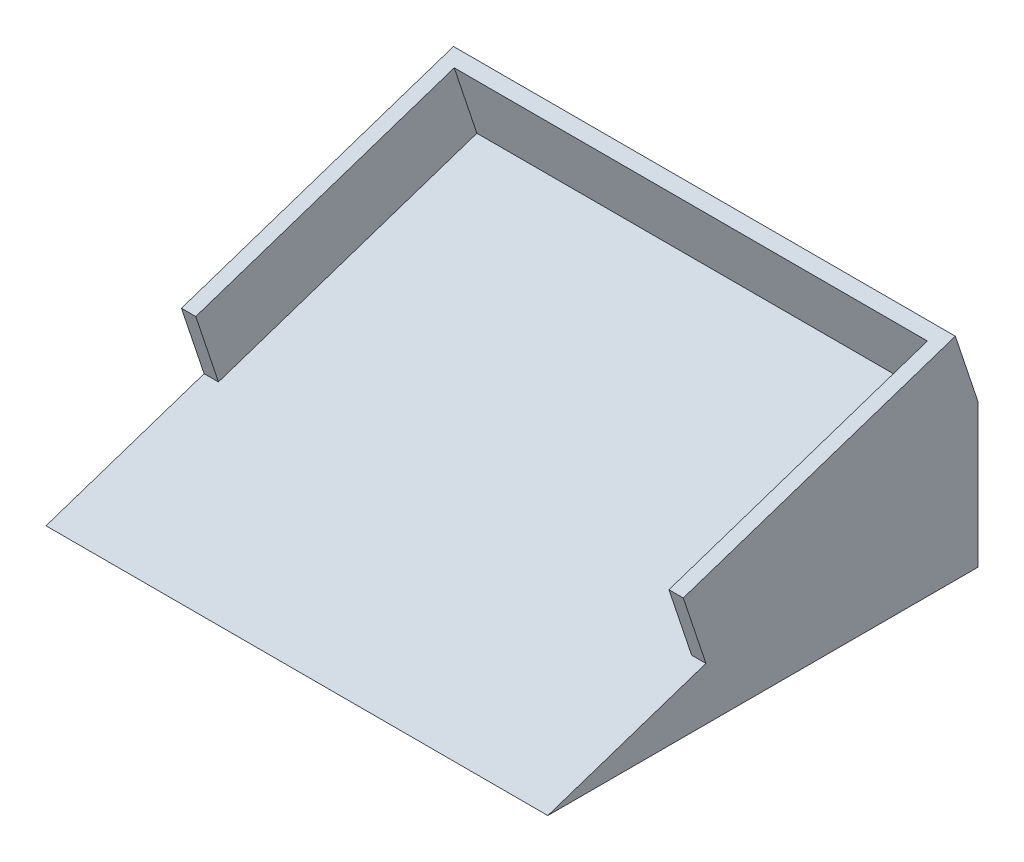
ISO-10303-21;
HEADER;
FILE_DESCRIPTION(('STEP AP214'),'2;1');
FILE_NAME('part.step','',(''),(''),'','','');
FILE_SCHEMA(('AUTOMOTIVE_DESIGN { 1 0 10303 214 1 1 1 1 }'));
ENDSEC;
DATA;
#1=APPLICATION_CONTEXT('core data for automotive mechanical design processes');
#2=APPLICATION_PROTOCOL_DEFINITION('international standard','automotive_design',2000,#1);
#3=PRODUCT_CONTEXT('',#1,'mechanical');
#4=PRODUCT('Part','Part','',(#3));
#5=PRODUCT_RELATED_PRODUCT_CATEGORY('part','',(#4));
#6=PRODUCT_DEFINITION_FORMATION('','',#4);
#7=PRODUCT_DEFINITION_CONTEXT('part definition',#1,'design');
#8=PRODUCT_DEFINITION('design','',#6,#7);
#9=PRODUCT_DEFINITION_SHAPE('','',#8);
#10=(LENGTH_UNIT() NAMED_UNIT(*) SI_UNIT(.MILLI.,.METRE.));
#11=(NAMED_UNIT(*) PLANE_ANGLE_UNIT() SI_UNIT($,.RADIAN.));
#12=(NAMED_UNIT(*) SI_UNIT($,.STERADIAN.) SOLID_ANGLE_UNIT());
#13=UNCERTAINTY_MEASURE_WITH_UNIT(LENGTH_MEASURE(1.E-05),#10,'distance_accuracy_value','');
#14=(GEOMETRIC_REPRESENTATION_CONTEXT(3) GLOBAL_UNCERTAINTY_ASSIGNED_CONTEXT((#13)) GLOBAL_UNIT_ASSIGNED_CONTEXT((#10,
#11,#12)) REPRESENTATION_CONTEXT('',''));
#15=CARTESIAN_POINT('',(0.,0.,0.));
#16=DIRECTION('',(0.,0.,1.));
#17=DIRECTION('',(1.,0.,0.));
#18=AXIS2_PLACEMENT_3D('',#15,#16,#17);
#19=CARTESIAN_POINT('',(0.,25.4,-76.2));
#20=DIRECTION('',(0.,-0.948683298050514,-0.316227766016838));
#21=DIRECTION('',(0.,0.316227766016838,-0.948683298050514));
#22=AXIS2_PLACEMENT_3D('',#19,#20,#21);
#23=PLANE('',#22);
#24=DIRECTION('',(1.,0.,0.));
#25=VECTOR('',#24,1.);
#26=CARTESIAN_POINT('',(0.,9.33562948634463,-28.0068884590339));
#27=LINE('',#26,#25);
#28=CARTESIAN_POINT('',(0.,9.33562948634464,-28.0068884590339));
#29=VERTEX_POINT('',#28);
#30=CARTESIAN_POINT('',(2.54,9.33562948634463,-28.0068884590339));
#31=VERTEX_POINT('',#30);
#32=EDGE_CURVE('E217',#29,#31,#27,.T.);
#33=ORIENTED_EDGE('',*,*,#32,.F.);
#34=DIRECTION('',(0.,0.316227766016838,-0.948683298050514));
#35=VECTOR('',#34,1.);
#36=CARTESIAN_POINT('',(0.,25.4,-76.2));
#37=LINE('',#36,#35);
#38=CARTESIAN_POINT('',(0.,0.,0.));
#39=VERTEX_POINT('',#38);
#40=EDGE_CURVE('E140',#39,#29,#37,.T.);
#41=ORIENTED_EDGE('',*,*,#40,.F.);
#42=DIRECTION('',(1.,0.,0.));
#43=VECTOR('',#42,1.);
#44=CARTESIAN_POINT('',(0.,0.,0.));
#45=LINE('',#44,#43);
#46=CARTESIAN_POINT('',(88.9,0.,0.));
#47=VERTEX_POINT('',#46);
#48=EDGE_CURVE('E161',#39,#47,#45,.T.);
#49=ORIENTED_EDGE('',*,*,#48,.T.);
#50=DIRECTION('',(0.,0.316227766016838,-0.948683298050514));
#51=VECTOR('',#50,1.);
#52=CARTESIAN_POINT('',(88.9,25.4,-76.2));
#53=LINE('',#52,#51);
#54=CARTESIAN_POINT('',(88.9,9.33562948634464,-28.0068884590339));
#55=VERTEX_POINT('',#54);
#56=EDGE_CURVE('E142',#47,#55,#53,.T.);
#57=ORIENTED_EDGE('',*,*,#56,.T.);
#58=DIRECTION('',(1.,0.,0.));
#59=VECTOR('',#58,1.);
#60=CARTESIAN_POINT('',(86.36,9.33562948634463,-28.0068884590339));
#61=LINE('',#60,#59);
#62=CARTESIAN_POINT('',(86.36,9.33562948634464,-28.0068884590339));
#63=VERTEX_POINT('',#62);
#64=EDGE_CURVE('E136',#63,#55,#61,.T.);
#65=ORIENTED_EDGE('',*,*,#64,.F.);
#66=DIRECTION('',(0.,-0.316227766016838,0.948683298050514));
#67=VECTOR('',#66,1.);
#68=CARTESIAN_POINT('',(86.36,24.5967814743172,-73.7903444229517));
#69=LINE('',#68,#67);
#70=CARTESIAN_POINT('',(86.36,24.5967814743172,-73.7903444229517));
#71=VERTEX_POINT('',#70);
#72=EDGE_CURVE('E221',#71,#63,#69,.T.);
#73=ORIENTED_EDGE('',*,*,#72,.F.);
#74=DIRECTION('',(1.,0.,0.));
#75=VECTOR('',#74,1.);
#76=CARTESIAN_POINT('',(2.54,24.5967814743172,-73.7903444229517));
#77=LINE('',#76,#75);
#78=CARTESIAN_POINT('',(2.54,24.5967814743172,-73.7903444229517));
#79=VERTEX_POINT('',#78);
#80=EDGE_CURVE('E60',#79,#71,#77,.T.);
#81=ORIENTED_EDGE('',*,*,#80,.F.);
#82=DIRECTION('',(0.,0.316227766016838,-0.948683298050514));
#83=VECTOR('',#82,1.);
#84=CARTESIAN_POINT('',(2.54,9.33562948634463,-28.0068884590339));
#85=LINE('',#84,#83);
#86=EDGE_CURVE('E55',#31,#79,#85,.T.);
#87=ORIENTED_EDGE('',*,*,#86,.F.);
#88=EDGE_LOOP('',(#33,#41,#49,#57,#65,#73,#81,#87));
#89=FACE_BOUND('',#88,.T.);
#90=ADVANCED_FACE('F39',(#89),#23,.F.);
#91=CARTESIAN_POINT('',(0.,25.4,0.));
#92=DIRECTION('',(1.,0.,0.));
#93=DIRECTION('',(0.,0.,-1.));
#94=AXIS2_PLACEMENT_3D('',#91,#92,#93);
#95=PLANE('',#94);
#96=DIRECTION('',(0.,0.,1.));
#97=VECTOR('',#96,1.);
#98=CARTESIAN_POINT('',(0.,0.,0.));
#99=LINE('',#98,#97);
#100=CARTESIAN_POINT('',(0.,0.,-76.2));
#101=VERTEX_POINT('',#100);
#102=EDGE_CURVE('E152',#101,#39,#99,.T.);
#103=ORIENTED_EDGE('',*,*,#102,.T.);
#104=ORIENTED_EDGE('',*,*,#40,.T.);
#105=DIRECTION('',(0.,-0.948683298050514,-0.316227766016838));
#106=VECTOR('',#105,1.);
#107=CARTESIAN_POINT('',(0.,21.3839073715862,-23.9907958306201));
#108=LINE('',#107,#106);
#109=CARTESIAN_POINT('',(0.,21.3839073715862,-23.9907958306201));
#110=VERTEX_POINT('',#109);
#111=EDGE_CURVE('E119',#110,#29,#108,.T.);
#112=ORIENTED_EDGE('',*,*,#111,.F.);
#113=DIRECTION('',(0.,-0.316227766016838,0.948683298050514));
#114=VECTOR('',#113,1.);
#115=CARTESIAN_POINT('',(0.,37.4482778852415,-72.1839073715862));
#116=LINE('',#115,#114);
#117=CARTESIAN_POINT('',(0.,37.4482778852415,-72.1839073715862));
#118=VERTEX_POINT('',#117);
#119=EDGE_CURVE('E126',#118,#110,#116,.T.);
#120=ORIENTED_EDGE('',*,*,#119,.F.);
#121=DIRECTION('',(0.,-0.948683298050514,-0.316227766016838));
#122=VECTOR('',#121,1.);
#123=CARTESIAN_POINT('',(0.,37.4482778852415,-72.1839073715862));
#124=LINE('',#123,#122);
#125=CARTESIAN_POINT('',(0.,25.4,-76.2));
#126=VERTEX_POINT('',#125);
#127=EDGE_CURVE('E171',#118,#126,#124,.T.);
#128=ORIENTED_EDGE('',*,*,#127,.T.);
#129=DIRECTION('',(0.,-1.,0.));
#130=VECTOR('',#129,1.);
#131=CARTESIAN_POINT('',(0.,25.4,-76.2));
#132=LINE('',#131,#130);
#133=EDGE_CURVE('E48',#126,#101,#132,.T.);
#134=ORIENTED_EDGE('',*,*,#133,.T.);
#135=EDGE_LOOP('',(#103,#104,#112,#120,#128,#134));
#136=FACE_BOUND('',#135,.T.);
#137=ADVANCED_FACE('F41',(#136),#95,.F.);
#138=CARTESIAN_POINT('',(88.9,25.4,0.));
#139=DIRECTION('',(-1.,0.,0.));
#140=DIRECTION('',(0.,0.,1.));
#141=AXIS2_PLACEMENT_3D('',#138,#139,#140);
#142=PLANE('',#141);
#143=DIRECTION('',(0.,-1.,0.));
#144=VECTOR('',#143,1.);
#145=CARTESIAN_POINT('',(88.9,25.4,-76.2));
#146=LINE('',#145,#144);
#147=CARTESIAN_POINT('',(88.9,25.4,-76.2));
#148=VERTEX_POINT('',#147);
#149=CARTESIAN_POINT('',(88.9,0.,-76.2));
#150=VERTEX_POINT('',#149);
#151=EDGE_CURVE('E11',#148,#150,#146,.T.);
#152=ORIENTED_EDGE('',*,*,#151,.F.);
#153=DIRECTION('',(0.,-0.948683298050514,-0.316227766016838));
#154=VECTOR('',#153,1.);
#155=CARTESIAN_POINT('',(88.9,37.4482778852415,-72.1839073715862));
#156=LINE('',#155,#154);
#157=CARTESIAN_POINT('',(88.9,37.4482778852415,-72.1839073715862));
#158=VERTEX_POINT('',#157);
#159=EDGE_CURVE('E193',#158,#148,#156,.T.);
#160=ORIENTED_EDGE('',*,*,#159,.F.);
#161=DIRECTION('',(0.,0.316227766016838,-0.948683298050514));
#162=VECTOR('',#161,1.);
#163=CARTESIAN_POINT('',(88.9,21.3839073715862,-23.9907958306201));
#164=LINE('',#163,#162);
#165=CARTESIAN_POINT('',(88.9,21.3839073715862,-23.9907958306201));
#166=VERTEX_POINT('',#165);
#167=EDGE_CURVE('E188',#166,#158,#164,.T.);
#168=ORIENTED_EDGE('',*,*,#167,.F.);
#169=DIRECTION('',(0.,-0.948683298050514,-0.316227766016838));
#170=VECTOR('',#169,1.);
#171=CARTESIAN_POINT('',(88.9,21.3839073715862,-23.9907958306201));
#172=LINE('',#171,#170);
#173=EDGE_CURVE('E186',#166,#55,#172,.T.);
#174=ORIENTED_EDGE('',*,*,#173,.T.);
#175=ORIENTED_EDGE('',*,*,#56,.F.);
#176=DIRECTION('',(0.,0.,-1.));
#177=VECTOR('',#176,1.);
#178=CARTESIAN_POINT('',(88.9,0.,0.));
#179=LINE('',#178,#177);
#180=EDGE_CURVE('E164',#47,#150,#179,.T.);
#181=ORIENTED_EDGE('',*,*,#180,.T.);
#182=EDGE_LOOP('',(#152,#160,#168,#174,#175,#181));
#183=FACE_BOUND('',#182,.T.);
#184=ADVANCED_FACE('F183',(#183),#142,.F.);
#185=CARTESIAN_POINT('',(0.,25.4,-76.2));
#186=DIRECTION('',(0.,0.,1.));
#187=DIRECTION('',(1.,0.,0.));
#188=AXIS2_PLACEMENT_3D('',#185,#186,#187);
#189=PLANE('',#188);
#190=DIRECTION('',(-1.,0.,0.));
#191=VECTOR('',#190,1.);
#192=CARTESIAN_POINT('',(0.,0.,-76.2));
#193=LINE('',#192,#191);
#194=EDGE_CURVE('E158',#150,#101,#193,.T.);
#195=ORIENTED_EDGE('',*,*,#194,.T.);
#196=ORIENTED_EDGE('',*,*,#133,.F.);
#197=DIRECTION('',(-1.,0.,0.));
#198=VECTOR('',#197,1.);
#199=CARTESIAN_POINT('',(0.,25.4,-76.2));
#200=LINE('',#199,#198);
#201=EDGE_CURVE('E154',#148,#126,#200,.T.);
#202=ORIENTED_EDGE('',*,*,#201,.F.);
#203=ORIENTED_EDGE('',*,*,#151,.T.);
#204=EDGE_LOOP('',(#195,#196,#202,#203));
#205=FACE_BOUND('',#204,.T.);
#206=ADVANCED_FACE('F251',(#205),#189,.F.);
#207=CARTESIAN_POINT('',(0.,0.,0.));
#208=DIRECTION('',(0.,-1.,0.));
#209=DIRECTION('',(0.,0.,-1.));
#210=AXIS2_PLACEMENT_3D('',#207,#208,#209);
#211=PLANE('',#210);
#212=ORIENTED_EDGE('',*,*,#102,.F.);
#213=ORIENTED_EDGE('',*,*,#194,.F.);
#214=ORIENTED_EDGE('',*,*,#180,.F.);
#215=ORIENTED_EDGE('',*,*,#48,.F.);
#216=EDGE_LOOP('',(#212,#213,#214,#215));
#217=FACE_BOUND('',#216,.T.);
#218=ADVANCED_FACE('F177',(#217),#211,.T.);
#219=CARTESIAN_POINT('',(0.,21.3839073715862,-23.9907958306201));
#220=DIRECTION('',(0.,0.316227766016838,-0.948683298050514));
#221=DIRECTION('',(0.,0.948683298050514,0.316227766016838));
#222=AXIS2_PLACEMENT_3D('',#219,#220,#221);
#223=PLANE('',#222);
#224=ORIENTED_EDGE('',*,*,#32,.T.);
#225=DIRECTION('',(0.,-0.948683298050514,-0.316227766016838));
#226=VECTOR('',#225,1.);
#227=CARTESIAN_POINT('',(2.54,21.3839073715862,-23.9907958306201));
#228=LINE('',#227,#226);
#229=CARTESIAN_POINT('',(2.54,21.3839073715862,-23.9907958306201));
#230=VERTEX_POINT('',#229);
#231=EDGE_CURVE('E121',#230,#31,#228,.T.);
#232=ORIENTED_EDGE('',*,*,#231,.F.);
#233=DIRECTION('',(1.,0.,0.));
#234=VECTOR('',#233,1.);
#235=CARTESIAN_POINT('',(0.,21.3839073715862,-23.9907958306201));
#236=LINE('',#235,#234);
#237=EDGE_CURVE('E115',#110,#230,#236,.T.);
#238=ORIENTED_EDGE('',*,*,#237,.F.);
#239=ORIENTED_EDGE('',*,*,#111,.T.);
#240=EDGE_LOOP('',(#224,#232,#238,#239));
#241=FACE_BOUND('',#240,.T.);
#242=ADVANCED_FACE('F117',(#241),#223,.F.);
#243=CARTESIAN_POINT('',(2.54,21.3839073715862,-23.9907958306201));
#244=DIRECTION('',(-1.,0.,0.));
#245=DIRECTION('',(0.,0.,1.));
#246=AXIS2_PLACEMENT_3D('',#243,#244,#245);
#247=PLANE('',#246);
#248=ORIENTED_EDGE('',*,*,#86,.T.);
#249=DIRECTION('',(0.,-0.948683298050514,-0.316227766016838));
#250=VECTOR('',#249,1.);
#251=CARTESIAN_POINT('',(2.54,36.6450593595588,-69.7742517945379));
#252=LINE('',#251,#250);
#253=CARTESIAN_POINT('',(2.54,36.6450593595588,-69.7742517945379));
#254=VERTEX_POINT('',#253);
#255=EDGE_CURVE('E147',#254,#79,#252,.T.);
#256=ORIENTED_EDGE('',*,*,#255,.F.);
#257=DIRECTION('',(0.,0.316227766016838,-0.948683298050514));
#258=VECTOR('',#257,1.);
#259=CARTESIAN_POINT('',(2.54,21.3839073715862,-23.9907958306201));
#260=LINE('',#259,#258);
#261=EDGE_CURVE('E125',#230,#254,#260,.T.);
#262=ORIENTED_EDGE('',*,*,#261,.F.);
#263=ORIENTED_EDGE('',*,*,#231,.T.);
#264=EDGE_LOOP('',(#248,#256,#262,#263));
#265=FACE_BOUND('',#264,.T.);
#266=ADVANCED_FACE('F215',(#265),#247,.F.);
#267=CARTESIAN_POINT('',(2.54,36.6450593595588,-69.7742517945379));
#268=DIRECTION('',(0.,0.316227766016838,-0.948683298050514));
#269=DIRECTION('',(0.,0.948683298050514,0.316227766016838));
#270=AXIS2_PLACEMENT_3D('',#267,#268,#269);
#271=PLANE('',#270);
#272=ORIENTED_EDGE('',*,*,#80,.T.);
#273=DIRECTION('',(0.,-0.948683298050514,-0.316227766016838));
#274=VECTOR('',#273,1.);
#275=CARTESIAN_POINT('',(86.36,36.6450593595588,-69.7742517945379));
#276=LINE('',#275,#274);
#277=CARTESIAN_POINT('',(86.36,36.6450593595588,-69.7742517945379));
#278=VERTEX_POINT('',#277);
#279=EDGE_CURVE('E198',#278,#71,#276,.T.);
#280=ORIENTED_EDGE('',*,*,#279,.F.);
#281=DIRECTION('',(1.,0.,0.));
#282=VECTOR('',#281,1.);
#283=CARTESIAN_POINT('',(2.54,36.6450593595588,-69.7742517945379));
#284=LINE('',#283,#282);
#285=EDGE_CURVE('E213',#254,#278,#284,.T.);
#286=ORIENTED_EDGE('',*,*,#285,.F.);
#287=ORIENTED_EDGE('',*,*,#255,.T.);
#288=EDGE_LOOP('',(#272,#280,#286,#287));
#289=FACE_BOUND('',#288,.T.);
#290=ADVANCED_FACE('F211',(#289),#271,.F.);
#291=CARTESIAN_POINT('',(86.36,36.6450593595588,-69.7742517945379));
#292=DIRECTION('',(1.,0.,0.));
#293=DIRECTION('',(0.,0.,-1.));
#294=AXIS2_PLACEMENT_3D('',#291,#292,#293);
#295=PLANE('',#294);
#296=ORIENTED_EDGE('',*,*,#72,.T.);
#297=DIRECTION('',(0.,-0.948683298050514,-0.316227766016838));
#298=VECTOR('',#297,1.);
#299=CARTESIAN_POINT('',(86.36,21.3839073715862,-23.9907958306201));
#300=LINE('',#299,#298);
#301=CARTESIAN_POINT('',(86.36,21.3839073715862,-23.9907958306201));
#302=VERTEX_POINT('',#301);
#303=EDGE_CURVE('E192',#302,#63,#300,.T.);
#304=ORIENTED_EDGE('',*,*,#303,.F.);
#305=DIRECTION('',(0.,-0.316227766016838,0.948683298050514));
#306=VECTOR('',#305,1.);
#307=CARTESIAN_POINT('',(86.36,36.6450593595588,-69.7742517945379));
#308=LINE('',#307,#306);
#309=EDGE_CURVE('E238',#278,#302,#308,.T.);
#310=ORIENTED_EDGE('',*,*,#309,.F.);
#311=ORIENTED_EDGE('',*,*,#279,.T.);
#312=EDGE_LOOP('',(#296,#304,#310,#311));
#313=FACE_BOUND('',#312,.T.);
#314=ADVANCED_FACE('F247',(#313),#295,.F.);
#315=CARTESIAN_POINT('',(86.36,21.3839073715862,-23.9907958306201));
#316=DIRECTION('',(0.,0.316227766016838,-0.948683298050514));
#317=DIRECTION('',(0.,0.948683298050514,0.316227766016838));
#318=AXIS2_PLACEMENT_3D('',#315,#316,#317);
#319=PLANE('',#318);
#320=ORIENTED_EDGE('',*,*,#64,.T.);
#321=ORIENTED_EDGE('',*,*,#173,.F.);
#322=DIRECTION('',(1.,0.,0.));
#323=VECTOR('',#322,1.);
#324=CARTESIAN_POINT('',(86.36,21.3839073715862,-23.9907958306201));
#325=LINE('',#324,#323);
#326=EDGE_CURVE('E233',#302,#166,#325,.T.);
#327=ORIENTED_EDGE('',*,*,#326,.F.);
#328=ORIENTED_EDGE('',*,*,#303,.T.);
#329=EDGE_LOOP('',(#320,#321,#327,#328));
#330=FACE_BOUND('',#329,.T.);
#331=ADVANCED_FACE('F248',(#330),#319,.F.);
#332=CARTESIAN_POINT('',(88.9,37.4482778852415,-72.1839073715862));
#333=DIRECTION('',(0.,-0.316227766016838,0.948683298050514));
#334=DIRECTION('',(0.,-0.948683298050514,-0.316227766016838));
#335=AXIS2_PLACEMENT_3D('',#332,#333,#334);
#336=PLANE('',#335);
#337=ORIENTED_EDGE('',*,*,#201,.T.);
#338=ORIENTED_EDGE('',*,*,#127,.F.);
#339=DIRECTION('',(-1.,0.,0.));
#340=VECTOR('',#339,1.);
#341=CARTESIAN_POINT('',(88.9,37.4482778852415,-72.1839073715862));
#342=LINE('',#341,#340);
#343=EDGE_CURVE('E131',#158,#118,#342,.T.);
#344=ORIENTED_EDGE('',*,*,#343,.F.);
#345=ORIENTED_EDGE('',*,*,#159,.T.);
#346=EDGE_LOOP('',(#337,#338,#344,#345));
#347=FACE_BOUND('',#346,.T.);
#348=ADVANCED_FACE('F250',(#347),#336,.F.);
#349=CARTESIAN_POINT('',(0.,12.0482778852415,4.01609262841384));
#350=DIRECTION('',(0.,0.948683298050514,0.316227766016838));
#351=DIRECTION('',(0.,-0.316227766016838,0.948683298050514));
#352=AXIS2_PLACEMENT_3D('',#349,#350,#351);
#353=PLANE('',#352);
#354=ORIENTED_EDGE('',*,*,#119,.T.);
#355=ORIENTED_EDGE('',*,*,#237,.T.);
#356=ORIENTED_EDGE('',*,*,#261,.T.);
#357=ORIENTED_EDGE('',*,*,#285,.T.);
#358=ORIENTED_EDGE('',*,*,#309,.T.);
#359=ORIENTED_EDGE('',*,*,#326,.T.);
#360=ORIENTED_EDGE('',*,*,#167,.T.);
#361=ORIENTED_EDGE('',*,*,#343,.T.);
#362=EDGE_LOOP('',(#354,#355,#356,#357,#358,#359,#360,#361));
#363=FACE_BOUND('',#362,.T.);
#364=ADVANCED_FACE('F129',(#363),#353,.T.);
#365=CLOSED_SHELL('',(#90,#137,#184,#206,#218,#242,#266,#290,#314,#331,#348,#364));
#366=MANIFOLD_SOLID_BREP('B2',#365);
#367=ADVANCED_BREP_SHAPE_REPRESENTATION('',(#18,#366),#14);
#368=SHAPE_DEFINITION_REPRESENTATION(#9,#367);
ENDSEC;
END-ISO-10303-21;
